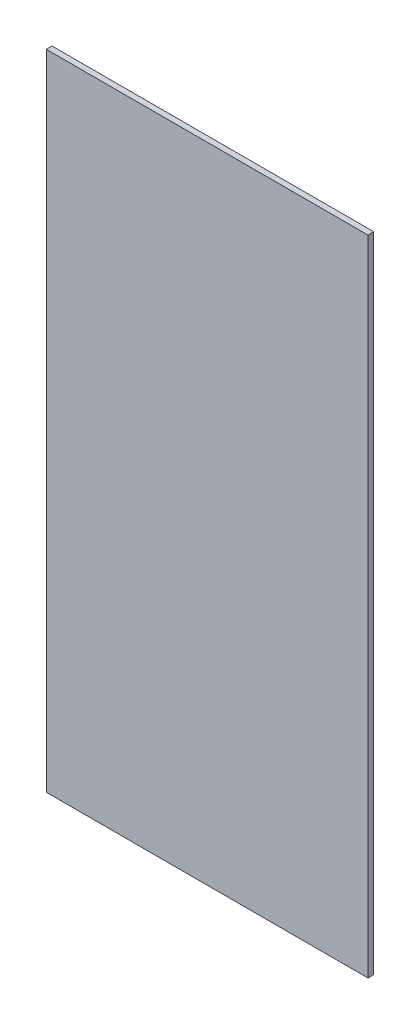
ISO-10303-21;
HEADER;
FILE_DESCRIPTION(('STEP AP214'),'2;1');
FILE_NAME('part.step','',(''),(''),'','','');
FILE_SCHEMA(('AUTOMOTIVE_DESIGN { 1 0 10303 214 1 1 1 1 }'));
ENDSEC;
DATA;
#1=APPLICATION_CONTEXT('core data for automotive mechanical design processes');
#2=APPLICATION_PROTOCOL_DEFINITION('international standard','automotive_design',2000,#1);
#3=PRODUCT_CONTEXT('',#1,'mechanical');
#4=PRODUCT('Part','Part','',(#3));
#5=PRODUCT_RELATED_PRODUCT_CATEGORY('part','',(#4));
#6=PRODUCT_DEFINITION_FORMATION('','',#4);
#7=PRODUCT_DEFINITION_CONTEXT('part definition',#1,'design');
#8=PRODUCT_DEFINITION('design','',#6,#7);
#9=PRODUCT_DEFINITION_SHAPE('','',#8);
#10=(LENGTH_UNIT() NAMED_UNIT(*) SI_UNIT(.MILLI.,.METRE.));
#11=(NAMED_UNIT(*) PLANE_ANGLE_UNIT() SI_UNIT($,.RADIAN.));
#12=(NAMED_UNIT(*) SI_UNIT($,.STERADIAN.) SOLID_ANGLE_UNIT());
#13=UNCERTAINTY_MEASURE_WITH_UNIT(LENGTH_MEASURE(1.E-05),#10,'distance_accuracy_value','');
#14=(GEOMETRIC_REPRESENTATION_CONTEXT(3) GLOBAL_UNCERTAINTY_ASSIGNED_CONTEXT((#13)) GLOBAL_UNIT_ASSIGNED_CONTEXT((#10,
#11,#12)) REPRESENTATION_CONTEXT('',''));
#15=CARTESIAN_POINT('',(0.,0.,0.));
#16=DIRECTION('',(0.,0.,1.));
#17=DIRECTION('',(1.,0.,0.));
#18=AXIS2_PLACEMENT_3D('',#15,#16,#17);
#19=CARTESIAN_POINT('',(-88.9,177.8,3.175));
#20=DIRECTION('',(1.,0.,0.));
#21=DIRECTION('',(0.,1.,0.));
#22=AXIS2_PLACEMENT_3D('',#19,#20,#21);
#23=PLANE('',#22);
#24=DIRECTION('',(0.,-1.,0.));
#25=VECTOR('',#24,1.);
#26=CARTESIAN_POINT('',(-88.9,177.8,0.));
#27=LINE('',#26,#25);
#28=CARTESIAN_POINT('',(-88.9,177.8,0.));
#29=VERTEX_POINT('',#28);
#30=CARTESIAN_POINT('',(-88.8999999999999,-177.8,0.));
#31=VERTEX_POINT('',#30);
#32=EDGE_CURVE('E96',#29,#31,#27,.T.);
#33=ORIENTED_EDGE('',*,*,#32,.T.);
#34=DIRECTION('',(0.,0.,-1.));
#35=VECTOR('',#34,1.);
#36=CARTESIAN_POINT('',(-88.8999999999999,-177.8,3.175));
#37=LINE('',#36,#35);
#38=CARTESIAN_POINT('',(-88.8999999999999,-177.8,3.175));
#39=VERTEX_POINT('',#38);
#40=EDGE_CURVE('E11',#39,#31,#37,.T.);
#41=ORIENTED_EDGE('',*,*,#40,.F.);
#42=DIRECTION('',(0.,-1.,0.));
#43=VECTOR('',#42,1.);
#44=CARTESIAN_POINT('',(-88.9,177.8,3.175));
#45=LINE('',#44,#43);
#46=CARTESIAN_POINT('',(-88.9,177.8,3.175));
#47=VERTEX_POINT('',#46);
#48=EDGE_CURVE('E84',#47,#39,#45,.T.);
#49=ORIENTED_EDGE('',*,*,#48,.F.);
#50=DIRECTION('',(0.,0.,-1.));
#51=VECTOR('',#50,1.);
#52=CARTESIAN_POINT('',(-88.9,177.8,3.175));
#53=LINE('',#52,#51);
#54=EDGE_CURVE('E92',#47,#29,#53,.T.);
#55=ORIENTED_EDGE('',*,*,#54,.T.);
#56=EDGE_LOOP('',(#33,#41,#49,#55));
#57=FACE_BOUND('',#56,.T.);
#58=ADVANCED_FACE('F33',(#57),#23,.F.);
#59=CARTESIAN_POINT('',(88.9,-177.8,3.175));
#60=DIRECTION('',(0.,1.,0.));
#61=DIRECTION('',(-1.,0.,0.));
#62=AXIS2_PLACEMENT_3D('',#59,#60,#61);
#63=PLANE('',#62);
#64=DIRECTION('',(1.,0.,0.));
#65=VECTOR('',#64,1.);
#66=CARTESIAN_POINT('',(88.9,-177.8,0.));
#67=LINE('',#66,#65);
#68=CARTESIAN_POINT('',(88.9,-177.8,0.));
#69=VERTEX_POINT('',#68);
#70=EDGE_CURVE('E88',#31,#69,#67,.T.);
#71=ORIENTED_EDGE('',*,*,#70,.T.);
#72=DIRECTION('',(0.,0.,-1.));
#73=VECTOR('',#72,1.);
#74=CARTESIAN_POINT('',(88.9,-177.8,3.175));
#75=LINE('',#74,#73);
#76=CARTESIAN_POINT('',(88.9,-177.8,3.175));
#77=VERTEX_POINT('',#76);
#78=EDGE_CURVE('E41',#77,#69,#75,.T.);
#79=ORIENTED_EDGE('',*,*,#78,.F.);
#80=DIRECTION('',(1.,0.,0.));
#81=VECTOR('',#80,1.);
#82=CARTESIAN_POINT('',(88.9,-177.8,3.175));
#83=LINE('',#82,#81);
#84=EDGE_CURVE('E79',#39,#77,#83,.T.);
#85=ORIENTED_EDGE('',*,*,#84,.F.);
#86=ORIENTED_EDGE('',*,*,#40,.T.);
#87=EDGE_LOOP('',(#71,#79,#85,#86));
#88=FACE_BOUND('',#87,.T.);
#89=ADVANCED_FACE('F87',(#88),#63,.F.);
#90=CARTESIAN_POINT('',(88.9,177.8,3.175));
#91=DIRECTION('',(-1.,0.,0.));
#92=DIRECTION('',(0.,-1.,0.));
#93=AXIS2_PLACEMENT_3D('',#90,#91,#92);
#94=PLANE('',#93);
#95=DIRECTION('',(0.,1.,0.));
#96=VECTOR('',#95,1.);
#97=CARTESIAN_POINT('',(88.9,177.8,0.));
#98=LINE('',#97,#96);
#99=CARTESIAN_POINT('',(88.9,177.8,0.));
#100=VERTEX_POINT('',#99);
#101=EDGE_CURVE('E66',#69,#100,#98,.T.);
#102=ORIENTED_EDGE('',*,*,#101,.T.);
#103=DIRECTION('',(0.,0.,-1.));
#104=VECTOR('',#103,1.);
#105=CARTESIAN_POINT('',(88.9,177.8,3.175));
#106=LINE('',#105,#104);
#107=CARTESIAN_POINT('',(88.9,177.8,3.175));
#108=VERTEX_POINT('',#107);
#109=EDGE_CURVE('E89',#108,#100,#106,.T.);
#110=ORIENTED_EDGE('',*,*,#109,.F.);
#111=DIRECTION('',(0.,1.,0.));
#112=VECTOR('',#111,1.);
#113=CARTESIAN_POINT('',(88.9,177.8,3.175));
#114=LINE('',#113,#112);
#115=EDGE_CURVE('E82',#77,#108,#114,.T.);
#116=ORIENTED_EDGE('',*,*,#115,.F.);
#117=ORIENTED_EDGE('',*,*,#78,.T.);
#118=EDGE_LOOP('',(#102,#110,#116,#117));
#119=FACE_BOUND('',#118,.T.);
#120=ADVANCED_FACE('F90',(#119),#94,.F.);
#121=CARTESIAN_POINT('',(88.9,177.8,3.175));
#122=DIRECTION('',(0.,-1.,0.));
#123=DIRECTION('',(1.,0.,0.));
#124=AXIS2_PLACEMENT_3D('',#121,#122,#123);
#125=PLANE('',#124);
#126=DIRECTION('',(-1.,0.,0.));
#127=VECTOR('',#126,1.);
#128=CARTESIAN_POINT('',(88.9,177.8,0.));
#129=LINE('',#128,#127);
#130=EDGE_CURVE('E72',#100,#29,#129,.T.);
#131=ORIENTED_EDGE('',*,*,#130,.T.);
#132=ORIENTED_EDGE('',*,*,#54,.F.);
#133=DIRECTION('',(-1.,0.,0.));
#134=VECTOR('',#133,1.);
#135=CARTESIAN_POINT('',(88.9,177.8,3.175));
#136=LINE('',#135,#134);
#137=EDGE_CURVE('E49',#108,#47,#136,.T.);
#138=ORIENTED_EDGE('',*,*,#137,.F.);
#139=ORIENTED_EDGE('',*,*,#109,.T.);
#140=EDGE_LOOP('',(#131,#132,#138,#139));
#141=FACE_BOUND('',#140,.T.);
#142=ADVANCED_FACE('F103',(#141),#125,.F.);
#143=CARTESIAN_POINT('',(0.,0.,3.175));
#144=DIRECTION('',(0.,0.,-1.));
#145=DIRECTION('',(-1.,0.,0.));
#146=AXIS2_PLACEMENT_3D('',#143,#144,#145);
#147=PLANE('',#146);
#148=ORIENTED_EDGE('',*,*,#48,.T.);
#149=ORIENTED_EDGE('',*,*,#84,.T.);
#150=ORIENTED_EDGE('',*,*,#115,.T.);
#151=ORIENTED_EDGE('',*,*,#137,.T.);
#152=EDGE_LOOP('',(#148,#149,#150,#151));
#153=FACE_BOUND('',#152,.T.);
#154=ADVANCED_FACE('F80',(#153),#147,.F.);
#155=CARTESIAN_POINT('',(0.,0.,0.));
#156=DIRECTION('',(0.,0.,-1.));
#157=DIRECTION('',(-1.,0.,0.));
#158=AXIS2_PLACEMENT_3D('',#155,#156,#157);
#159=PLANE('',#158);
#160=ORIENTED_EDGE('',*,*,#32,.F.);
#161=ORIENTED_EDGE('',*,*,#130,.F.);
#162=ORIENTED_EDGE('',*,*,#101,.F.);
#163=ORIENTED_EDGE('',*,*,#70,.F.);
#164=EDGE_LOOP('',(#160,#161,#162,#163));
#165=FACE_BOUND('',#164,.T.);
#166=ADVANCED_FACE('F106',(#165),#159,.T.);
#167=CLOSED_SHELL('',(#58,#89,#120,#142,#154,#166));
#168=MANIFOLD_SOLID_BREP('B2',#167);
#169=ADVANCED_BREP_SHAPE_REPRESENTATION('',(#18,#168),#14);
#170=SHAPE_DEFINITION_REPRESENTATION(#9,#169);
ENDSEC;
END-ISO-10303-21;
